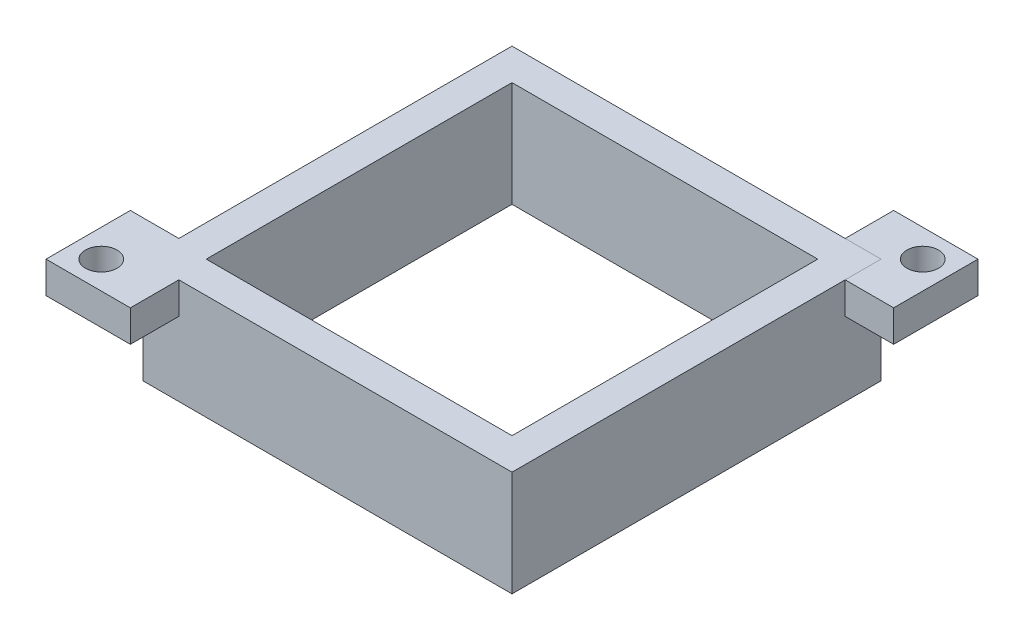
ISO-10303-21;
HEADER;
FILE_DESCRIPTION(('STEP AP214'),'2;1');
FILE_NAME('part.step','',(''),(''),'','','');
FILE_SCHEMA(('AUTOMOTIVE_DESIGN { 1 0 10303 214 1 1 1 1 }'));
ENDSEC;
DATA;
#1=APPLICATION_CONTEXT('core data for automotive mechanical design processes');
#2=APPLICATION_PROTOCOL_DEFINITION('international standard','automotive_design',2000,#1);
#3=PRODUCT_CONTEXT('',#1,'mechanical');
#4=PRODUCT('Part','Part','',(#3));
#5=PRODUCT_RELATED_PRODUCT_CATEGORY('part','',(#4));
#6=PRODUCT_DEFINITION_FORMATION('','',#4);
#7=PRODUCT_DEFINITION_CONTEXT('part definition',#1,'design');
#8=PRODUCT_DEFINITION('design','',#6,#7);
#9=PRODUCT_DEFINITION_SHAPE('','',#8);
#10=(LENGTH_UNIT() NAMED_UNIT(*) SI_UNIT(.MILLI.,.METRE.));
#11=(NAMED_UNIT(*) PLANE_ANGLE_UNIT() SI_UNIT($,.RADIAN.));
#12=(NAMED_UNIT(*) SI_UNIT($,.STERADIAN.) SOLID_ANGLE_UNIT());
#13=UNCERTAINTY_MEASURE_WITH_UNIT(LENGTH_MEASURE(1.E-05),#10,'distance_accuracy_value','');
#14=(GEOMETRIC_REPRESENTATION_CONTEXT(3) GLOBAL_UNCERTAINTY_ASSIGNED_CONTEXT((#13)) GLOBAL_UNIT_ASSIGNED_CONTEXT((#10,
#11,#12)) REPRESENTATION_CONTEXT('',''));
#15=CARTESIAN_POINT('',(0.,0.,0.));
#16=DIRECTION('',(0.,0.,1.));
#17=DIRECTION('',(1.,0.,0.));
#18=AXIS2_PLACEMENT_3D('',#15,#16,#17);
#19=CARTESIAN_POINT('',(17.5,7.,-17.5));
#20=DIRECTION('',(0.,0.,1.));
#21=DIRECTION('',(1.,0.,0.));
#22=AXIS2_PLACEMENT_3D('',#19,#20,#21);
#23=PLANE('',#22);
#24=DIRECTION('',(1.,0.,0.));
#25=VECTOR('',#24,1.);
#26=CARTESIAN_POINT('',(17.5,10.,-17.5));
#27=LINE('',#26,#25);
#28=CARTESIAN_POINT('',(14.1,10.,-17.5));
#29=VERTEX_POINT('',#28);
#30=CARTESIAN_POINT('',(17.5,10.,-17.5));
#31=VERTEX_POINT('',#30);
#32=EDGE_CURVE('E134',#29,#31,#27,.T.);
#33=ORIENTED_EDGE('',*,*,#32,.F.);
#34=DIRECTION('',(0.,1.,0.));
#35=VECTOR('',#34,1.);
#36=CARTESIAN_POINT('',(14.1,7.,-17.5));
#37=LINE('',#36,#35);
#38=CARTESIAN_POINT('',(14.1,7.,-17.5));
#39=VERTEX_POINT('',#38);
#40=EDGE_CURVE('E12',#39,#29,#37,.T.);
#41=ORIENTED_EDGE('',*,*,#40,.F.);
#42=DIRECTION('',(1.,0.,0.));
#43=VECTOR('',#42,1.);
#44=CARTESIAN_POINT('',(17.5,7.,-17.5));
#45=LINE('',#44,#43);
#46=CARTESIAN_POINT('',(17.5,7.,-17.5));
#47=VERTEX_POINT('',#46);
#48=EDGE_CURVE('E149',#39,#47,#45,.T.);
#49=ORIENTED_EDGE('',*,*,#48,.T.);
#50=DIRECTION('',(0.,1.,0.));
#51=VECTOR('',#50,1.);
#52=CARTESIAN_POINT('',(17.5,7.,-17.5));
#53=LINE('',#52,#51);
#54=EDGE_CURVE('E52',#47,#31,#53,.T.);
#55=ORIENTED_EDGE('',*,*,#54,.T.);
#56=EDGE_LOOP('',(#33,#41,#49,#55));
#57=FACE_BOUND('',#56,.T.);
#58=ADVANCED_FACE('F49',(#57),#23,.T.);
#59=CARTESIAN_POINT('',(14.1,7.,-17.5));
#60=DIRECTION('',(-1.,0.,0.));
#61=DIRECTION('',(0.,0.,1.));
#62=AXIS2_PLACEMENT_3D('',#59,#60,#61);
#63=PLANE('',#62);
#64=DIRECTION('',(0.,0.,1.));
#65=VECTOR('',#64,1.);
#66=CARTESIAN_POINT('',(14.1,10.,-17.5));
#67=LINE('',#66,#65);
#68=CARTESIAN_POINT('',(14.1,10.,-22.1));
#69=VERTEX_POINT('',#68);
#70=EDGE_CURVE('E147',#69,#29,#67,.T.);
#71=ORIENTED_EDGE('',*,*,#70,.F.);
#72=DIRECTION('',(0.,1.,0.));
#73=VECTOR('',#72,1.);
#74=CARTESIAN_POINT('',(14.1,7.,-22.1));
#75=LINE('',#74,#73);
#76=CARTESIAN_POINT('',(14.1,7.,-22.1));
#77=VERTEX_POINT('',#76);
#78=EDGE_CURVE('E58',#77,#69,#75,.T.);
#79=ORIENTED_EDGE('',*,*,#78,.F.);
#80=DIRECTION('',(0.,0.,1.));
#81=VECTOR('',#80,1.);
#82=CARTESIAN_POINT('',(14.1,7.,-17.5));
#83=LINE('',#82,#81);
#84=EDGE_CURVE('E124',#77,#39,#83,.T.);
#85=ORIENTED_EDGE('',*,*,#84,.T.);
#86=ORIENTED_EDGE('',*,*,#40,.T.);
#87=EDGE_LOOP('',(#71,#79,#85,#86));
#88=FACE_BOUND('',#87,.T.);
#89=ADVANCED_FACE('F157',(#88),#63,.T.);
#90=CARTESIAN_POINT('',(14.1,7.,-22.1));
#91=DIRECTION('',(0.,0.,-1.));
#92=DIRECTION('',(-1.,0.,0.));
#93=AXIS2_PLACEMENT_3D('',#90,#91,#92);
#94=PLANE('',#93);
#95=DIRECTION('',(-1.,0.,0.));
#96=VECTOR('',#95,1.);
#97=CARTESIAN_POINT('',(14.1,10.,-22.1));
#98=LINE('',#97,#96);
#99=CARTESIAN_POINT('',(22.1,10.,-22.1));
#100=VERTEX_POINT('',#99);
#101=EDGE_CURVE('E111',#100,#69,#98,.T.);
#102=ORIENTED_EDGE('',*,*,#101,.F.);
#103=DIRECTION('',(0.,1.,0.));
#104=VECTOR('',#103,1.);
#105=CARTESIAN_POINT('',(22.1,7.,-22.1));
#106=LINE('',#105,#104);
#107=CARTESIAN_POINT('',(22.1,7.,-22.1));
#108=VERTEX_POINT('',#107);
#109=EDGE_CURVE('E106',#108,#100,#106,.T.);
#110=ORIENTED_EDGE('',*,*,#109,.F.);
#111=DIRECTION('',(-1.,0.,0.));
#112=VECTOR('',#111,1.);
#113=CARTESIAN_POINT('',(14.1,7.,-22.1));
#114=LINE('',#113,#112);
#115=EDGE_CURVE('E109',#108,#77,#114,.T.);
#116=ORIENTED_EDGE('',*,*,#115,.T.);
#117=ORIENTED_EDGE('',*,*,#78,.T.);
#118=EDGE_LOOP('',(#102,#110,#116,#117));
#119=FACE_BOUND('',#118,.T.);
#120=ADVANCED_FACE('F108',(#119),#94,.T.);
#121=CARTESIAN_POINT('',(22.1,7.,-22.1));
#122=DIRECTION('',(1.,0.,0.));
#123=DIRECTION('',(0.,0.,-1.));
#124=AXIS2_PLACEMENT_3D('',#121,#122,#123);
#125=PLANE('',#124);
#126=DIRECTION('',(0.,0.,-1.));
#127=VECTOR('',#126,1.);
#128=CARTESIAN_POINT('',(22.1,10.,-22.1));
#129=LINE('',#128,#127);
#130=CARTESIAN_POINT('',(22.1,10.,-14.1));
#131=VERTEX_POINT('',#130);
#132=EDGE_CURVE('E144',#131,#100,#129,.T.);
#133=ORIENTED_EDGE('',*,*,#132,.F.);
#134=DIRECTION('',(0.,1.,0.));
#135=VECTOR('',#134,1.);
#136=CARTESIAN_POINT('',(22.1,7.,-14.1));
#137=LINE('',#136,#135);
#138=CARTESIAN_POINT('',(22.1,7.,-14.1));
#139=VERTEX_POINT('',#138);
#140=EDGE_CURVE('E116',#139,#131,#137,.T.);
#141=ORIENTED_EDGE('',*,*,#140,.F.);
#142=DIRECTION('',(0.,0.,-1.));
#143=VECTOR('',#142,1.);
#144=CARTESIAN_POINT('',(22.1,7.,-22.1));
#145=LINE('',#144,#143);
#146=EDGE_CURVE('E122',#139,#108,#145,.T.);
#147=ORIENTED_EDGE('',*,*,#146,.T.);
#148=ORIENTED_EDGE('',*,*,#109,.T.);
#149=EDGE_LOOP('',(#133,#141,#147,#148));
#150=FACE_BOUND('',#149,.T.);
#151=ADVANCED_FACE('F126',(#150),#125,.T.);
#152=CARTESIAN_POINT('',(22.1,7.,-14.1));
#153=DIRECTION('',(0.,0.,1.));
#154=DIRECTION('',(1.,0.,0.));
#155=AXIS2_PLACEMENT_3D('',#152,#153,#154);
#156=PLANE('',#155);
#157=DIRECTION('',(1.,0.,0.));
#158=VECTOR('',#157,1.);
#159=CARTESIAN_POINT('',(22.1,10.,-14.1));
#160=LINE('',#159,#158);
#161=CARTESIAN_POINT('',(17.5,10.,-14.1));
#162=VERTEX_POINT('',#161);
#163=EDGE_CURVE('E141',#162,#131,#160,.T.);
#164=ORIENTED_EDGE('',*,*,#163,.F.);
#165=DIRECTION('',(0.,1.,0.));
#166=VECTOR('',#165,1.);
#167=CARTESIAN_POINT('',(17.5,7.,-14.1));
#168=LINE('',#167,#166);
#169=CARTESIAN_POINT('',(17.5,7.,-14.1));
#170=VERTEX_POINT('',#169);
#171=EDGE_CURVE('E152',#170,#162,#168,.T.);
#172=ORIENTED_EDGE('',*,*,#171,.F.);
#173=DIRECTION('',(1.,0.,0.));
#174=VECTOR('',#173,1.);
#175=CARTESIAN_POINT('',(22.1,7.,-14.1));
#176=LINE('',#175,#174);
#177=EDGE_CURVE('E127',#170,#139,#176,.T.);
#178=ORIENTED_EDGE('',*,*,#177,.T.);
#179=ORIENTED_EDGE('',*,*,#140,.T.);
#180=EDGE_LOOP('',(#164,#172,#178,#179));
#181=FACE_BOUND('',#180,.T.);
#182=ADVANCED_FACE('F170',(#181),#156,.T.);
#183=CARTESIAN_POINT('',(17.5,7.,-14.1));
#184=DIRECTION('',(-1.,0.,0.));
#185=DIRECTION('',(0.,0.,1.));
#186=AXIS2_PLACEMENT_3D('',#183,#184,#185);
#187=PLANE('',#186);
#188=DIRECTION('',(0.,0.,1.));
#189=VECTOR('',#188,1.);
#190=CARTESIAN_POINT('',(17.5,10.,-14.1));
#191=LINE('',#190,#189);
#192=EDGE_CURVE('E137',#31,#162,#191,.T.);
#193=ORIENTED_EDGE('',*,*,#192,.F.);
#194=ORIENTED_EDGE('',*,*,#54,.F.);
#195=DIRECTION('',(0.,0.,1.));
#196=VECTOR('',#195,1.);
#197=CARTESIAN_POINT('',(17.5,7.,-14.1));
#198=LINE('',#197,#196);
#199=EDGE_CURVE('E129',#47,#170,#198,.T.);
#200=ORIENTED_EDGE('',*,*,#199,.T.);
#201=ORIENTED_EDGE('',*,*,#171,.T.);
#202=EDGE_LOOP('',(#193,#194,#200,#201));
#203=FACE_BOUND('',#202,.T.);
#204=ADVANCED_FACE('F154',(#203),#187,.T.);
#205=CARTESIAN_POINT('',(0.,7.,0.));
#206=DIRECTION('',(0.,-1.,0.));
#207=DIRECTION('',(0.,0.,-1.));
#208=AXIS2_PLACEMENT_3D('',#205,#206,#207);
#209=PLANE('',#208);
#210=CARTESIAN_POINT('',(19.4798989873223,7.,-19.4798989873223));
#211=DIRECTION('',(0.,1.,0.));
#212=DIRECTION('',(0.,0.,1.));
#213=AXIS2_PLACEMENT_3D('',#210,#211,#212);
#214=CIRCLE('',#213,1.5);
#215=CARTESIAN_POINT('',(19.4798989873223,7.,-17.9798989873223));
#216=VERTEX_POINT('',#215);
#217=EDGE_CURVE('E138',#216,#216,#214,.T.);
#218=ORIENTED_EDGE('',*,*,#217,.T.);
#219=EDGE_LOOP('',(#218));
#220=FACE_BOUND('',#219,.T.);
#221=ORIENTED_EDGE('',*,*,#48,.F.);
#222=ORIENTED_EDGE('',*,*,#84,.F.);
#223=ORIENTED_EDGE('',*,*,#115,.F.);
#224=ORIENTED_EDGE('',*,*,#146,.F.);
#225=ORIENTED_EDGE('',*,*,#177,.F.);
#226=ORIENTED_EDGE('',*,*,#199,.F.);
#227=EDGE_LOOP('',(#221,#222,#223,#224,#225,#226));
#228=FACE_BOUND('',#227,.T.);
#229=ADVANCED_FACE('F120',(#220,#228),#209,.T.);
#230=CARTESIAN_POINT('',(0.,10.,0.));
#231=DIRECTION('',(0.,-1.,0.));
#232=DIRECTION('',(0.,0.,-1.));
#233=AXIS2_PLACEMENT_3D('',#230,#231,#232);
#234=PLANE('',#233);
#235=CARTESIAN_POINT('',(19.4798989873223,10.,-19.4798989873223));
#236=DIRECTION('',(0.,1.,0.));
#237=DIRECTION('',(0.,0.,1.));
#238=AXIS2_PLACEMENT_3D('',#235,#236,#237);
#239=CIRCLE('',#238,1.5);
#240=CARTESIAN_POINT('',(19.4798989873223,10.,-17.9798989873223));
#241=VERTEX_POINT('',#240);
#242=EDGE_CURVE('E193',#241,#241,#239,.T.);
#243=ORIENTED_EDGE('',*,*,#242,.F.);
#244=EDGE_LOOP('',(#243));
#245=FACE_BOUND('',#244,.T.);
#246=ORIENTED_EDGE('',*,*,#32,.T.);
#247=ORIENTED_EDGE('',*,*,#192,.T.);
#248=ORIENTED_EDGE('',*,*,#163,.T.);
#249=ORIENTED_EDGE('',*,*,#132,.T.);
#250=ORIENTED_EDGE('',*,*,#101,.T.);
#251=ORIENTED_EDGE('',*,*,#70,.T.);
#252=EDGE_LOOP('',(#246,#247,#248,#249,#250,#251));
#253=FACE_BOUND('',#252,.T.);
#254=ADVANCED_FACE('F156',(#245,#253),#234,.F.);
#255=CARTESIAN_POINT('',(19.4798989873223,7.,-19.4798989873223));
#256=DIRECTION('',(0.,1.,0.));
#257=DIRECTION('',(0.,0.,1.));
#258=AXIS2_PLACEMENT_3D('',#255,#256,#257);
#259=CYLINDRICAL_SURFACE('',#258,1.5);
#260=ORIENTED_EDGE('',*,*,#217,.F.);
#261=EDGE_LOOP('',(#260));
#262=FACE_BOUND('',#261,.T.);
#263=ORIENTED_EDGE('',*,*,#242,.T.);
#264=EDGE_LOOP('',(#263));
#265=FACE_BOUND('',#264,.T.);
#266=ADVANCED_FACE('F181',(#262,#265),#259,.F.);
#267=CLOSED_SHELL('',(#58,#89,#120,#151,#182,#204,#229,#254,#266));
#268=MANIFOLD_SOLID_BREP('B2',#267);
#269=CARTESIAN_POINT('',(0.,10.,0.));
#270=DIRECTION('',(0.,1.,0.));
#271=DIRECTION('',(0.,0.,1.));
#272=AXIS2_PLACEMENT_3D('',#269,#270,#271);
#273=PLANE('',#272);
#274=DIRECTION('',(0.,0.,-1.));
#275=VECTOR('',#274,1.);
#276=CARTESIAN_POINT('',(17.5,10.,-17.5));
#277=LINE('',#276,#275);
#278=CARTESIAN_POINT('',(17.5,10.,17.5));
#279=VERTEX_POINT('',#278);
#280=CARTESIAN_POINT('',(17.5,10.,-17.5));
#281=VERTEX_POINT('',#280);
#282=EDGE_CURVE('E375',#279,#281,#277,.T.);
#283=ORIENTED_EDGE('',*,*,#282,.T.);
#284=DIRECTION('',(-1.,0.,0.));
#285=VECTOR('',#284,1.);
#286=CARTESIAN_POINT('',(-17.5,10.,-17.5));
#287=LINE('',#286,#285);
#288=CARTESIAN_POINT('',(-17.5,10.,-17.5));
#289=VERTEX_POINT('',#288);
#290=EDGE_CURVE('E366',#281,#289,#287,.T.);
#291=ORIENTED_EDGE('',*,*,#290,.T.);
#292=DIRECTION('',(0.,0.,1.));
#293=VECTOR('',#292,1.);
#294=CARTESIAN_POINT('',(-17.5,10.,-17.5));
#295=LINE('',#294,#293);
#296=CARTESIAN_POINT('',(-17.5,10.,14.1));
#297=VERTEX_POINT('',#296);
#298=EDGE_CURVE('E360',#289,#297,#295,.T.);
#299=ORIENTED_EDGE('',*,*,#298,.T.);
#300=DIRECTION('',(1.,0.,0.));
#301=VECTOR('',#300,1.);
#302=CARTESIAN_POINT('',(-17.5,10.,14.1));
#303=LINE('',#302,#301);
#304=CARTESIAN_POINT('',(-22.1,10.,14.1));
#305=VERTEX_POINT('',#304);
#306=EDGE_CURVE('E343',#305,#297,#303,.T.);
#307=ORIENTED_EDGE('',*,*,#306,.F.);
#308=DIRECTION('',(0.,0.,-1.));
#309=VECTOR('',#308,1.);
#310=CARTESIAN_POINT('',(-22.1,10.,14.1));
#311=LINE('',#310,#309);
#312=CARTESIAN_POINT('',(-22.1,10.,22.1));
#313=VERTEX_POINT('',#312);
#314=EDGE_CURVE('E493',#313,#305,#311,.T.);
#315=ORIENTED_EDGE('',*,*,#314,.F.);
#316=DIRECTION('',(-1.,0.,0.));
#317=VECTOR('',#316,1.);
#318=CARTESIAN_POINT('',(-22.1,10.,22.1));
#319=LINE('',#318,#317);
#320=CARTESIAN_POINT('',(-14.1,10.,22.1));
#321=VERTEX_POINT('',#320);
#322=EDGE_CURVE('E483',#321,#313,#319,.T.);
#323=ORIENTED_EDGE('',*,*,#322,.F.);
#324=DIRECTION('',(0.,0.,1.));
#325=VECTOR('',#324,1.);
#326=CARTESIAN_POINT('',(-14.1,10.,22.1));
#327=LINE('',#326,#325);
#328=CARTESIAN_POINT('',(-14.1,10.,17.5));
#329=VERTEX_POINT('',#328);
#330=EDGE_CURVE('E262',#329,#321,#327,.T.);
#331=ORIENTED_EDGE('',*,*,#330,.F.);
#332=DIRECTION('',(1.,0.,0.));
#333=VECTOR('',#332,1.);
#334=CARTESIAN_POINT('',(-17.5,10.,17.5));
#335=LINE('',#334,#333);
#336=EDGE_CURVE('E369',#329,#279,#335,.T.);
#337=ORIENTED_EDGE('',*,*,#336,.T.);
#338=EDGE_LOOP('',(#283,#291,#299,#307,#315,#323,#331,#337));
#339=FACE_BOUND('',#338,.T.);
#340=DIRECTION('',(-1.,0.,0.));
#341=VECTOR('',#340,1.);
#342=CARTESIAN_POINT('',(-14.5,10.,-14.5));
#343=LINE('',#342,#341);
#344=CARTESIAN_POINT('',(14.5,10.,-14.5));
#345=VERTEX_POINT('',#344);
#346=CARTESIAN_POINT('',(-14.5,10.,-14.5));
#347=VERTEX_POINT('',#346);
#348=EDGE_CURVE('E453',#345,#347,#343,.T.);
#349=ORIENTED_EDGE('',*,*,#348,.F.);
#350=DIRECTION('',(0.,0.,-1.));
#351=VECTOR('',#350,1.);
#352=CARTESIAN_POINT('',(14.5,10.,-14.5));
#353=LINE('',#352,#351);
#354=CARTESIAN_POINT('',(14.5,10.,14.5));
#355=VERTEX_POINT('',#354);
#356=EDGE_CURVE('E434',#355,#345,#353,.T.);
#357=ORIENTED_EDGE('',*,*,#356,.F.);
#358=DIRECTION('',(1.,0.,0.));
#359=VECTOR('',#358,1.);
#360=CARTESIAN_POINT('',(-14.5,10.,14.5));
#361=LINE('',#360,#359);
#362=CARTESIAN_POINT('',(-14.5,10.,14.5));
#363=VERTEX_POINT('',#362);
#364=EDGE_CURVE('E429',#363,#355,#361,.T.);
#365=ORIENTED_EDGE('',*,*,#364,.F.);
#366=DIRECTION('',(0.,0.,1.));
#367=VECTOR('',#366,1.);
#368=CARTESIAN_POINT('',(-14.5,10.,-14.5));
#369=LINE('',#368,#367);
#370=EDGE_CURVE('E450',#347,#363,#369,.T.);
#371=ORIENTED_EDGE('',*,*,#370,.F.);
#372=EDGE_LOOP('',(#349,#357,#365,#371));
#373=FACE_BOUND('',#372,.T.);
#374=CARTESIAN_POINT('',(-19.4798989873223,10.,19.4798989873223));
#375=DIRECTION('',(0.,-1.,0.));
#376=DIRECTION('',(1.,0.,0.));
#377=AXIS2_PLACEMENT_3D('',#374,#375,#376);
#378=CIRCLE('',#377,1.5);
#379=CARTESIAN_POINT('',(-17.9798989873223,10.,19.4798989873223));
#380=VERTEX_POINT('',#379);
#381=EDGE_CURVE('E447',#380,#380,#378,.T.);
#382=ORIENTED_EDGE('',*,*,#381,.T.);
#383=EDGE_LOOP('',(#382));
#384=FACE_BOUND('',#383,.T.);
#385=ADVANCED_FACE('F246',(#339,#373,#384),#273,.T.);
#386=CARTESIAN_POINT('',(0.,0.,0.));
#387=DIRECTION('',(0.,1.,0.));
#388=DIRECTION('',(0.,0.,1.));
#389=AXIS2_PLACEMENT_3D('',#386,#387,#388);
#390=PLANE('',#389);
#391=DIRECTION('',(0.,0.,-1.));
#392=VECTOR('',#391,1.);
#393=CARTESIAN_POINT('',(17.5,0.,-17.5));
#394=LINE('',#393,#392);
#395=CARTESIAN_POINT('',(17.5,0.,17.5));
#396=VERTEX_POINT('',#395);
#397=CARTESIAN_POINT('',(17.5,0.,-17.5));
#398=VERTEX_POINT('',#397);
#399=EDGE_CURVE('E379',#396,#398,#394,.T.);
#400=ORIENTED_EDGE('',*,*,#399,.F.);
#401=DIRECTION('',(1.,0.,0.));
#402=VECTOR('',#401,1.);
#403=CARTESIAN_POINT('',(-17.5,0.,17.5));
#404=LINE('',#403,#402);
#405=CARTESIAN_POINT('',(-17.5,0.,17.5));
#406=VERTEX_POINT('',#405);
#407=EDGE_CURVE('E391',#406,#396,#404,.T.);
#408=ORIENTED_EDGE('',*,*,#407,.F.);
#409=DIRECTION('',(0.,0.,1.));
#410=VECTOR('',#409,1.);
#411=CARTESIAN_POINT('',(-17.5,0.,-17.5));
#412=LINE('',#411,#410);
#413=CARTESIAN_POINT('',(-17.5,0.,-17.5));
#414=VERTEX_POINT('',#413);
#415=EDGE_CURVE('E387',#414,#406,#412,.T.);
#416=ORIENTED_EDGE('',*,*,#415,.F.);
#417=DIRECTION('',(-1.,0.,0.));
#418=VECTOR('',#417,1.);
#419=CARTESIAN_POINT('',(-17.5,0.,-17.5));
#420=LINE('',#419,#418);
#421=EDGE_CURVE('E383',#398,#414,#420,.T.);
#422=ORIENTED_EDGE('',*,*,#421,.F.);
#423=EDGE_LOOP('',(#400,#408,#416,#422));
#424=FACE_BOUND('',#423,.T.);
#425=DIRECTION('',(0.,0.,-1.));
#426=VECTOR('',#425,1.);
#427=CARTESIAN_POINT('',(14.5,0.,-14.5));
#428=LINE('',#427,#426);
#429=CARTESIAN_POINT('',(14.5,0.,14.5));
#430=VERTEX_POINT('',#429);
#431=CARTESIAN_POINT('',(14.5,0.,-14.5));
#432=VERTEX_POINT('',#431);
#433=EDGE_CURVE('E443',#430,#432,#428,.T.);
#434=ORIENTED_EDGE('',*,*,#433,.T.);
#435=DIRECTION('',(-1.,0.,0.));
#436=VECTOR('',#435,1.);
#437=CARTESIAN_POINT('',(-14.5,0.,-14.5));
#438=LINE('',#437,#436);
#439=CARTESIAN_POINT('',(-14.5,0.,-14.5));
#440=VERTEX_POINT('',#439);
#441=EDGE_CURVE('E439',#432,#440,#438,.T.);
#442=ORIENTED_EDGE('',*,*,#441,.T.);
#443=DIRECTION('',(0.,0.,1.));
#444=VECTOR('',#443,1.);
#445=CARTESIAN_POINT('',(-14.5,0.,-14.5));
#446=LINE('',#445,#444);
#447=CARTESIAN_POINT('',(-14.5,0.,14.5));
#448=VERTEX_POINT('',#447);
#449=EDGE_CURVE('E435',#440,#448,#446,.T.);
#450=ORIENTED_EDGE('',*,*,#449,.T.);
#451=DIRECTION('',(1.,0.,0.));
#452=VECTOR('',#451,1.);
#453=CARTESIAN_POINT('',(-14.5,0.,14.5));
#454=LINE('',#453,#452);
#455=EDGE_CURVE('E430',#448,#430,#454,.T.);
#456=ORIENTED_EDGE('',*,*,#455,.T.);
#457=EDGE_LOOP('',(#434,#442,#450,#456));
#458=FACE_BOUND('',#457,.T.);
#459=ADVANCED_FACE('F405',(#424,#458),#390,.F.);
#460=CARTESIAN_POINT('',(17.5,10.,-17.5));
#461=DIRECTION('',(-1.,0.,0.));
#462=DIRECTION('',(0.,0.,1.));
#463=AXIS2_PLACEMENT_3D('',#460,#461,#462);
#464=PLANE('',#463);
#465=ORIENTED_EDGE('',*,*,#399,.T.);
#466=DIRECTION('',(0.,-1.,0.));
#467=VECTOR('',#466,1.);
#468=CARTESIAN_POINT('',(17.5,10.,-17.5));
#469=LINE('',#468,#467);
#470=EDGE_CURVE('E47',#281,#398,#469,.T.);
#471=ORIENTED_EDGE('',*,*,#470,.F.);
#472=ORIENTED_EDGE('',*,*,#282,.F.);
#473=DIRECTION('',(0.,-1.,0.));
#474=VECTOR('',#473,1.);
#475=CARTESIAN_POINT('',(17.5,10.,17.5));
#476=LINE('',#475,#474);
#477=EDGE_CURVE('E373',#279,#396,#476,.T.);
#478=ORIENTED_EDGE('',*,*,#477,.T.);
#479=EDGE_LOOP('',(#465,#471,#472,#478));
#480=FACE_BOUND('',#479,.T.);
#481=ADVANCED_FACE('F248',(#480),#464,.F.);
#482=CARTESIAN_POINT('',(-17.5,10.,-17.5));
#483=DIRECTION('',(0.,0.,1.));
#484=DIRECTION('',(1.,0.,0.));
#485=AXIS2_PLACEMENT_3D('',#482,#483,#484);
#486=PLANE('',#485);
#487=ORIENTED_EDGE('',*,*,#421,.T.);
#488=DIRECTION('',(0.,-1.,0.));
#489=VECTOR('',#488,1.);
#490=CARTESIAN_POINT('',(-17.5,10.,-17.5));
#491=LINE('',#490,#489);
#492=EDGE_CURVE('E255',#289,#414,#491,.T.);
#493=ORIENTED_EDGE('',*,*,#492,.F.);
#494=ORIENTED_EDGE('',*,*,#290,.F.);
#495=ORIENTED_EDGE('',*,*,#470,.T.);
#496=EDGE_LOOP('',(#487,#493,#494,#495));
#497=FACE_BOUND('',#496,.T.);
#498=ADVANCED_FACE('F538',(#497),#486,.F.);
#499=CARTESIAN_POINT('',(-17.5,10.,-17.5));
#500=DIRECTION('',(1.,0.,0.));
#501=DIRECTION('',(0.,0.,-1.));
#502=AXIS2_PLACEMENT_3D('',#499,#500,#501);
#503=PLANE('',#502);
#504=DIRECTION('',(0.,0.,1.));
#505=VECTOR('',#504,1.);
#506=CARTESIAN_POINT('',(-17.5,7.,17.5));
#507=LINE('',#506,#505);
#508=CARTESIAN_POINT('',(-17.5,7.,14.1));
#509=VERTEX_POINT('',#508);
#510=CARTESIAN_POINT('',(-17.5,7.,17.5));
#511=VERTEX_POINT('',#510);
#512=EDGE_CURVE('E354',#509,#511,#507,.T.);
#513=ORIENTED_EDGE('',*,*,#512,.F.);
#514=DIRECTION('',(0.,1.,0.));
#515=VECTOR('',#514,1.);
#516=CARTESIAN_POINT('',(-17.5,7.,14.1));
#517=LINE('',#516,#515);
#518=EDGE_CURVE('E347',#509,#297,#517,.T.);
#519=ORIENTED_EDGE('',*,*,#518,.T.);
#520=ORIENTED_EDGE('',*,*,#298,.F.);
#521=ORIENTED_EDGE('',*,*,#492,.T.);
#522=ORIENTED_EDGE('',*,*,#415,.T.);
#523=DIRECTION('',(0.,-1.,0.));
#524=VECTOR('',#523,1.);
#525=CARTESIAN_POINT('',(-17.5,10.,17.5));
#526=LINE('',#525,#524);
#527=EDGE_CURVE('E397',#511,#406,#526,.T.);
#528=ORIENTED_EDGE('',*,*,#527,.F.);
#529=EDGE_LOOP('',(#513,#519,#520,#521,#522,#528));
#530=FACE_BOUND('',#529,.T.);
#531=ADVANCED_FACE('F358',(#530),#503,.F.);
#532=CARTESIAN_POINT('',(-17.5,10.,17.5));
#533=DIRECTION('',(0.,0.,-1.));
#534=DIRECTION('',(-1.,0.,0.));
#535=AXIS2_PLACEMENT_3D('',#532,#533,#534);
#536=PLANE('',#535);
#537=ORIENTED_EDGE('',*,*,#336,.F.);
#538=DIRECTION('',(0.,1.,0.));
#539=VECTOR('',#538,1.);
#540=CARTESIAN_POINT('',(-14.1,7.,17.5));
#541=LINE('',#540,#539);
#542=CARTESIAN_POINT('',(-14.1,7.,17.5));
#543=VERTEX_POINT('',#542);
#544=EDGE_CURVE('E471',#543,#329,#541,.T.);
#545=ORIENTED_EDGE('',*,*,#544,.F.);
#546=DIRECTION('',(1.,0.,0.));
#547=VECTOR('',#546,1.);
#548=CARTESIAN_POINT('',(-14.1,7.,17.5));
#549=LINE('',#548,#547);
#550=EDGE_CURVE('E465',#511,#543,#549,.T.);
#551=ORIENTED_EDGE('',*,*,#550,.F.);
#552=ORIENTED_EDGE('',*,*,#527,.T.);
#553=ORIENTED_EDGE('',*,*,#407,.T.);
#554=ORIENTED_EDGE('',*,*,#477,.F.);
#555=EDGE_LOOP('',(#537,#545,#551,#552,#553,#554));
#556=FACE_BOUND('',#555,.T.);
#557=ADVANCED_FACE('F410',(#556),#536,.F.);
#558=CARTESIAN_POINT('',(14.5,10.,-14.5));
#559=DIRECTION('',(-1.,0.,0.));
#560=DIRECTION('',(0.,0.,1.));
#561=AXIS2_PLACEMENT_3D('',#558,#559,#560);
#562=PLANE('',#561);
#563=ORIENTED_EDGE('',*,*,#433,.F.);
#564=DIRECTION('',(0.,-1.,0.));
#565=VECTOR('',#564,1.);
#566=CARTESIAN_POINT('',(14.5,10.,14.5));
#567=LINE('',#566,#565);
#568=EDGE_CURVE('E425',#355,#430,#567,.T.);
#569=ORIENTED_EDGE('',*,*,#568,.F.);
#570=ORIENTED_EDGE('',*,*,#356,.T.);
#571=DIRECTION('',(0.,-1.,0.));
#572=VECTOR('',#571,1.);
#573=CARTESIAN_POINT('',(14.5,10.,-14.5));
#574=LINE('',#573,#572);
#575=EDGE_CURVE('E384',#345,#432,#574,.T.);
#576=ORIENTED_EDGE('',*,*,#575,.T.);
#577=EDGE_LOOP('',(#563,#569,#570,#576));
#578=FACE_BOUND('',#577,.T.);
#579=ADVANCED_FACE('F532',(#578),#562,.T.);
#580=CARTESIAN_POINT('',(-14.5,10.,-14.5));
#581=DIRECTION('',(0.,0.,1.));
#582=DIRECTION('',(1.,0.,0.));
#583=AXIS2_PLACEMENT_3D('',#580,#581,#582);
#584=PLANE('',#583);
#585=ORIENTED_EDGE('',*,*,#441,.F.);
#586=ORIENTED_EDGE('',*,*,#575,.F.);
#587=ORIENTED_EDGE('',*,*,#348,.T.);
#588=DIRECTION('',(0.,-1.,0.));
#589=VECTOR('',#588,1.);
#590=CARTESIAN_POINT('',(-14.5,10.,-14.5));
#591=LINE('',#590,#589);
#592=EDGE_CURVE('E420',#347,#440,#591,.T.);
#593=ORIENTED_EDGE('',*,*,#592,.T.);
#594=EDGE_LOOP('',(#585,#586,#587,#593));
#595=FACE_BOUND('',#594,.T.);
#596=ADVANCED_FACE('F580',(#595),#584,.T.);
#597=CARTESIAN_POINT('',(-14.5,10.,-14.5));
#598=DIRECTION('',(1.,0.,0.));
#599=DIRECTION('',(0.,0.,-1.));
#600=AXIS2_PLACEMENT_3D('',#597,#598,#599);
#601=PLANE('',#600);
#602=ORIENTED_EDGE('',*,*,#449,.F.);
#603=ORIENTED_EDGE('',*,*,#592,.F.);
#604=ORIENTED_EDGE('',*,*,#370,.T.);
#605=DIRECTION('',(0.,-1.,0.));
#606=VECTOR('',#605,1.);
#607=CARTESIAN_POINT('',(-14.5,10.,14.5));
#608=LINE('',#607,#606);
#609=EDGE_CURVE('E270',#363,#448,#608,.T.);
#610=ORIENTED_EDGE('',*,*,#609,.T.);
#611=EDGE_LOOP('',(#602,#603,#604,#610));
#612=FACE_BOUND('',#611,.T.);
#613=ADVANCED_FACE('F588',(#612),#601,.T.);
#614=CARTESIAN_POINT('',(-14.5,10.,14.5));
#615=DIRECTION('',(0.,0.,-1.));
#616=DIRECTION('',(-1.,0.,0.));
#617=AXIS2_PLACEMENT_3D('',#614,#615,#616);
#618=PLANE('',#617);
#619=ORIENTED_EDGE('',*,*,#455,.F.);
#620=ORIENTED_EDGE('',*,*,#609,.F.);
#621=ORIENTED_EDGE('',*,*,#364,.T.);
#622=ORIENTED_EDGE('',*,*,#568,.T.);
#623=EDGE_LOOP('',(#619,#620,#621,#622));
#624=FACE_BOUND('',#623,.T.);
#625=ADVANCED_FACE('F523',(#624),#618,.T.);
#626=CARTESIAN_POINT('',(-17.5,7.,14.1));
#627=DIRECTION('',(0.,0.,-1.));
#628=DIRECTION('',(1.,0.,0.));
#629=AXIS2_PLACEMENT_3D('',#626,#627,#628);
#630=PLANE('',#629);
#631=ORIENTED_EDGE('',*,*,#306,.T.);
#632=ORIENTED_EDGE('',*,*,#518,.F.);
#633=DIRECTION('',(1.,0.,0.));
#634=VECTOR('',#633,1.);
#635=CARTESIAN_POINT('',(-17.5,7.,14.1));
#636=LINE('',#635,#634);
#637=CARTESIAN_POINT('',(-22.1,7.,14.1));
#638=VERTEX_POINT('',#637);
#639=EDGE_CURVE('E496',#638,#509,#636,.T.);
#640=ORIENTED_EDGE('',*,*,#639,.F.);
#641=DIRECTION('',(0.,1.,0.));
#642=VECTOR('',#641,1.);
#643=CARTESIAN_POINT('',(-22.1,7.,14.1));
#644=LINE('',#643,#642);
#645=EDGE_CURVE('E350',#638,#305,#644,.T.);
#646=ORIENTED_EDGE('',*,*,#645,.T.);
#647=EDGE_LOOP('',(#631,#632,#640,#646));
#648=FACE_BOUND('',#647,.T.);
#649=ADVANCED_FACE('F345',(#648),#630,.T.);
#650=CARTESIAN_POINT('',(-22.1,7.,14.1));
#651=DIRECTION('',(-1.,0.,0.));
#652=DIRECTION('',(0.,0.,-1.));
#653=AXIS2_PLACEMENT_3D('',#650,#651,#652);
#654=PLANE('',#653);
#655=ORIENTED_EDGE('',*,*,#314,.T.);
#656=ORIENTED_EDGE('',*,*,#645,.F.);
#657=DIRECTION('',(0.,0.,-1.));
#658=VECTOR('',#657,1.);
#659=CARTESIAN_POINT('',(-22.1,7.,14.1));
#660=LINE('',#659,#658);
#661=CARTESIAN_POINT('',(-22.1,7.,22.1));
#662=VERTEX_POINT('',#661);
#663=EDGE_CURVE('E486',#662,#638,#660,.T.);
#664=ORIENTED_EDGE('',*,*,#663,.F.);
#665=DIRECTION('',(0.,1.,0.));
#666=VECTOR('',#665,1.);
#667=CARTESIAN_POINT('',(-22.1,7.,22.1));
#668=LINE('',#667,#666);
#669=EDGE_CURVE('E489',#662,#313,#668,.T.);
#670=ORIENTED_EDGE('',*,*,#669,.T.);
#671=EDGE_LOOP('',(#655,#656,#664,#670));
#672=FACE_BOUND('',#671,.T.);
#673=ADVANCED_FACE('F515',(#672),#654,.T.);
#674=CARTESIAN_POINT('',(-22.1,7.,22.1));
#675=DIRECTION('',(0.,0.,1.));
#676=DIRECTION('',(-1.,0.,0.));
#677=AXIS2_PLACEMENT_3D('',#674,#675,#676);
#678=PLANE('',#677);
#679=ORIENTED_EDGE('',*,*,#322,.T.);
#680=ORIENTED_EDGE('',*,*,#669,.F.);
#681=DIRECTION('',(-1.,0.,0.));
#682=VECTOR('',#681,1.);
#683=CARTESIAN_POINT('',(-22.1,7.,22.1));
#684=LINE('',#683,#682);
#685=CARTESIAN_POINT('',(-14.1,7.,22.1));
#686=VERTEX_POINT('',#685);
#687=EDGE_CURVE('E476',#686,#662,#684,.T.);
#688=ORIENTED_EDGE('',*,*,#687,.F.);
#689=DIRECTION('',(0.,1.,0.));
#690=VECTOR('',#689,1.);
#691=CARTESIAN_POINT('',(-14.1,7.,22.1));
#692=LINE('',#691,#690);
#693=EDGE_CURVE('E479',#686,#321,#692,.T.);
#694=ORIENTED_EDGE('',*,*,#693,.T.);
#695=EDGE_LOOP('',(#679,#680,#688,#694));
#696=FACE_BOUND('',#695,.T.);
#697=ADVANCED_FACE('F513',(#696),#678,.T.);
#698=CARTESIAN_POINT('',(-14.1,7.,22.1));
#699=DIRECTION('',(1.,0.,0.));
#700=DIRECTION('',(0.,0.,1.));
#701=AXIS2_PLACEMENT_3D('',#698,#699,#700);
#702=PLANE('',#701);
#703=ORIENTED_EDGE('',*,*,#330,.T.);
#704=ORIENTED_EDGE('',*,*,#693,.F.);
#705=DIRECTION('',(0.,0.,1.));
#706=VECTOR('',#705,1.);
#707=CARTESIAN_POINT('',(-14.1,7.,22.1));
#708=LINE('',#707,#706);
#709=EDGE_CURVE('E468',#543,#686,#708,.T.);
#710=ORIENTED_EDGE('',*,*,#709,.F.);
#711=ORIENTED_EDGE('',*,*,#544,.T.);
#712=EDGE_LOOP('',(#703,#704,#710,#711));
#713=FACE_BOUND('',#712,.T.);
#714=ADVANCED_FACE('F507',(#713),#702,.T.);
#715=CARTESIAN_POINT('',(0.,7.,0.));
#716=DIRECTION('',(0.,-1.,0.));
#717=DIRECTION('',(-1.,0.,0.));
#718=AXIS2_PLACEMENT_3D('',#715,#716,#717);
#719=PLANE('',#718);
#720=CARTESIAN_POINT('',(-19.4798989873223,7.,19.4798989873223));
#721=DIRECTION('',(0.,-1.,0.));
#722=DIRECTION('',(1.,0.,0.));
#723=AXIS2_PLACEMENT_3D('',#720,#721,#722);
#724=CIRCLE('',#723,1.5);
#725=CARTESIAN_POINT('',(-17.9798989873223,7.,19.4798989873223));
#726=VERTEX_POINT('',#725);
#727=EDGE_CURVE('E461',#726,#726,#724,.T.);
#728=ORIENTED_EDGE('',*,*,#727,.F.);
#729=EDGE_LOOP('',(#728));
#730=FACE_BOUND('',#729,.T.);
#731=ORIENTED_EDGE('',*,*,#512,.T.);
#732=ORIENTED_EDGE('',*,*,#550,.T.);
#733=ORIENTED_EDGE('',*,*,#709,.T.);
#734=ORIENTED_EDGE('',*,*,#687,.T.);
#735=ORIENTED_EDGE('',*,*,#663,.T.);
#736=ORIENTED_EDGE('',*,*,#639,.T.);
#737=EDGE_LOOP('',(#731,#732,#733,#734,#735,#736));
#738=FACE_BOUND('',#737,.T.);
#739=ADVANCED_FACE('F503',(#730,#738),#719,.T.);
#740=CARTESIAN_POINT('',(-19.4798989873223,7.,19.4798989873223));
#741=DIRECTION('',(0.,1.,0.));
#742=DIRECTION('',(1.,0.,0.));
#743=AXIS2_PLACEMENT_3D('',#740,#741,#742);
#744=CYLINDRICAL_SURFACE('',#743,1.5);
#745=ORIENTED_EDGE('',*,*,#727,.T.);
#746=EDGE_LOOP('',(#745));
#747=FACE_BOUND('',#746,.T.);
#748=ORIENTED_EDGE('',*,*,#381,.F.);
#749=EDGE_LOOP('',(#748));
#750=FACE_BOUND('',#749,.T.);
#751=ADVANCED_FACE('F634',(#747,#750),#744,.F.);
#752=CLOSED_SHELL('',(#385,#459,#481,#498,#531,#557,#579,#596,#613,#625,#649,#673,#697,#714,
#739,#751));
#753=MANIFOLD_SOLID_BREP('B6',#752);
#754=ADVANCED_BREP_SHAPE_REPRESENTATION('',(#18,#268,#753),#14);
#755=SHAPE_DEFINITION_REPRESENTATION(#9,#754);
ENDSEC;
END-ISO-10303-21;
